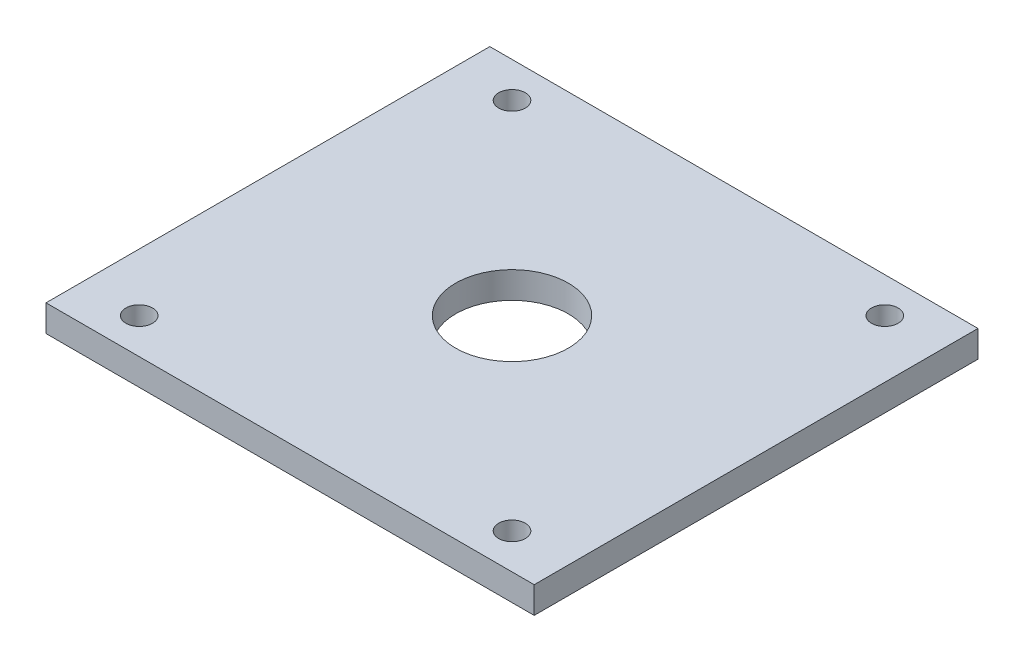
ISO-10303-21;
HEADER;
FILE_DESCRIPTION(('STEP AP214'),'2;1');
FILE_NAME('part.step','',(''),(''),'','','');
FILE_SCHEMA(('AUTOMOTIVE_DESIGN { 1 0 10303 214 1 1 1 1 }'));
ENDSEC;
DATA;
#1=APPLICATION_CONTEXT('core data for automotive mechanical design processes');
#2=APPLICATION_PROTOCOL_DEFINITION('international standard','automotive_design',2000,#1);
#3=PRODUCT_CONTEXT('',#1,'mechanical');
#4=PRODUCT('Part','Part','',(#3));
#5=PRODUCT_RELATED_PRODUCT_CATEGORY('part','',(#4));
#6=PRODUCT_DEFINITION_FORMATION('','',#4);
#7=PRODUCT_DEFINITION_CONTEXT('part definition',#1,'design');
#8=PRODUCT_DEFINITION('design','',#6,#7);
#9=PRODUCT_DEFINITION_SHAPE('','',#8);
#10=(LENGTH_UNIT() NAMED_UNIT(*) SI_UNIT(.MILLI.,.METRE.));
#11=(NAMED_UNIT(*) PLANE_ANGLE_UNIT() SI_UNIT($,.RADIAN.));
#12=(NAMED_UNIT(*) SI_UNIT($,.STERADIAN.) SOLID_ANGLE_UNIT());
#13=UNCERTAINTY_MEASURE_WITH_UNIT(LENGTH_MEASURE(1.E-05),#10,'distance_accuracy_value','');
#14=(GEOMETRIC_REPRESENTATION_CONTEXT(3) GLOBAL_UNCERTAINTY_ASSIGNED_CONTEXT((#13)) GLOBAL_UNIT_ASSIGNED_CONTEXT((#10,
#11,#12)) REPRESENTATION_CONTEXT('',''));
#15=CARTESIAN_POINT('',(0.,0.,0.));
#16=DIRECTION('',(0.,0.,1.));
#17=DIRECTION('',(1.,0.,0.));
#18=AXIS2_PLACEMENT_3D('',#15,#16,#17);
#19=CARTESIAN_POINT('',(27.5,3.,-25.));
#20=DIRECTION('',(-1.,0.,0.));
#21=DIRECTION('',(0.,0.,1.));
#22=AXIS2_PLACEMENT_3D('',#19,#20,#21);
#23=PLANE('',#22);
#24=DIRECTION('',(0.,0.,-1.));
#25=VECTOR('',#24,1.);
#26=CARTESIAN_POINT('',(27.5,0.,-25.));
#27=LINE('',#26,#25);
#28=CARTESIAN_POINT('',(27.5,0.,25.));
#29=VERTEX_POINT('',#28);
#30=CARTESIAN_POINT('',(27.5,0.,-25.));
#31=VERTEX_POINT('',#30);
#32=EDGE_CURVE('E101',#29,#31,#27,.T.);
#33=ORIENTED_EDGE('',*,*,#32,.T.);
#34=DIRECTION('',(0.,-1.,0.));
#35=VECTOR('',#34,1.);
#36=CARTESIAN_POINT('',(27.5,3.,-25.));
#37=LINE('',#36,#35);
#38=CARTESIAN_POINT('',(27.5,3.,-25.));
#39=VERTEX_POINT('',#38);
#40=EDGE_CURVE('E11',#39,#31,#37,.T.);
#41=ORIENTED_EDGE('',*,*,#40,.F.);
#42=DIRECTION('',(0.,0.,-1.));
#43=VECTOR('',#42,1.);
#44=CARTESIAN_POINT('',(27.5,3.,-25.));
#45=LINE('',#44,#43);
#46=CARTESIAN_POINT('',(27.5,3.,25.));
#47=VERTEX_POINT('',#46);
#48=EDGE_CURVE('E89',#47,#39,#45,.T.);
#49=ORIENTED_EDGE('',*,*,#48,.F.);
#50=DIRECTION('',(0.,-1.,0.));
#51=VECTOR('',#50,1.);
#52=CARTESIAN_POINT('',(27.5,3.,25.));
#53=LINE('',#52,#51);
#54=EDGE_CURVE('E97',#47,#29,#53,.T.);
#55=ORIENTED_EDGE('',*,*,#54,.T.);
#56=EDGE_LOOP('',(#33,#41,#49,#55));
#57=FACE_BOUND('',#56,.T.);
#58=ADVANCED_FACE('F38',(#57),#23,.F.);
#59=CARTESIAN_POINT('',(-27.5,3.,-25.));
#60=DIRECTION('',(0.,0.,1.));
#61=DIRECTION('',(1.,0.,0.));
#62=AXIS2_PLACEMENT_3D('',#59,#60,#61);
#63=PLANE('',#62);
#64=DIRECTION('',(-1.,0.,0.));
#65=VECTOR('',#64,1.);
#66=CARTESIAN_POINT('',(-27.5,0.,-25.));
#67=LINE('',#66,#65);
#68=CARTESIAN_POINT('',(-27.5,0.,-25.));
#69=VERTEX_POINT('',#68);
#70=EDGE_CURVE('E93',#31,#69,#67,.T.);
#71=ORIENTED_EDGE('',*,*,#70,.T.);
#72=DIRECTION('',(0.,-1.,0.));
#73=VECTOR('',#72,1.);
#74=CARTESIAN_POINT('',(-27.5,3.,-25.));
#75=LINE('',#74,#73);
#76=CARTESIAN_POINT('',(-27.5,3.,-25.));
#77=VERTEX_POINT('',#76);
#78=EDGE_CURVE('E46',#77,#69,#75,.T.);
#79=ORIENTED_EDGE('',*,*,#78,.F.);
#80=DIRECTION('',(-1.,0.,0.));
#81=VECTOR('',#80,1.);
#82=CARTESIAN_POINT('',(-27.5,3.,-25.));
#83=LINE('',#82,#81);
#84=EDGE_CURVE('E84',#39,#77,#83,.T.);
#85=ORIENTED_EDGE('',*,*,#84,.F.);
#86=ORIENTED_EDGE('',*,*,#40,.T.);
#87=EDGE_LOOP('',(#71,#79,#85,#86));
#88=FACE_BOUND('',#87,.T.);
#89=ADVANCED_FACE('F92',(#88),#63,.F.);
#90=CARTESIAN_POINT('',(-27.5,3.,-25.));
#91=DIRECTION('',(1.,0.,0.));
#92=DIRECTION('',(0.,0.,-1.));
#93=AXIS2_PLACEMENT_3D('',#90,#91,#92);
#94=PLANE('',#93);
#95=DIRECTION('',(0.,0.,1.));
#96=VECTOR('',#95,1.);
#97=CARTESIAN_POINT('',(-27.5,0.,-25.));
#98=LINE('',#97,#96);
#99=CARTESIAN_POINT('',(-27.5,0.,25.));
#100=VERTEX_POINT('',#99);
#101=EDGE_CURVE('E71',#69,#100,#98,.T.);
#102=ORIENTED_EDGE('',*,*,#101,.T.);
#103=DIRECTION('',(0.,-1.,0.));
#104=VECTOR('',#103,1.);
#105=CARTESIAN_POINT('',(-27.5,3.,25.));
#106=LINE('',#105,#104);
#107=CARTESIAN_POINT('',(-27.5,3.,25.));
#108=VERTEX_POINT('',#107);
#109=EDGE_CURVE('E94',#108,#100,#106,.T.);
#110=ORIENTED_EDGE('',*,*,#109,.F.);
#111=DIRECTION('',(0.,0.,1.));
#112=VECTOR('',#111,1.);
#113=CARTESIAN_POINT('',(-27.5,3.,-25.));
#114=LINE('',#113,#112);
#115=EDGE_CURVE('E87',#77,#108,#114,.T.);
#116=ORIENTED_EDGE('',*,*,#115,.F.);
#117=ORIENTED_EDGE('',*,*,#78,.T.);
#118=EDGE_LOOP('',(#102,#110,#116,#117));
#119=FACE_BOUND('',#118,.T.);
#120=ADVANCED_FACE('F95',(#119),#94,.F.);
#121=CARTESIAN_POINT('',(-27.5,3.,25.));
#122=DIRECTION('',(0.,0.,-1.));
#123=DIRECTION('',(-1.,0.,0.));
#124=AXIS2_PLACEMENT_3D('',#121,#122,#123);
#125=PLANE('',#124);
#126=DIRECTION('',(1.,0.,0.));
#127=VECTOR('',#126,1.);
#128=CARTESIAN_POINT('',(-27.5,0.,25.));
#129=LINE('',#128,#127);
#130=EDGE_CURVE('E77',#100,#29,#129,.T.);
#131=ORIENTED_EDGE('',*,*,#130,.T.);
#132=ORIENTED_EDGE('',*,*,#54,.F.);
#133=DIRECTION('',(1.,0.,0.));
#134=VECTOR('',#133,1.);
#135=CARTESIAN_POINT('',(-27.5,3.,25.));
#136=LINE('',#135,#134);
#137=EDGE_CURVE('E54',#108,#47,#136,.T.);
#138=ORIENTED_EDGE('',*,*,#137,.F.);
#139=ORIENTED_EDGE('',*,*,#109,.T.);
#140=EDGE_LOOP('',(#131,#132,#138,#139));
#141=FACE_BOUND('',#140,.T.);
#142=ADVANCED_FACE('F109',(#141),#125,.F.);
#143=CARTESIAN_POINT('',(0.,3.,0.));
#144=DIRECTION('',(0.,1.,0.));
#145=DIRECTION('',(0.,0.,1.));
#146=AXIS2_PLACEMENT_3D('',#143,#144,#145);
#147=PLANE('',#146);
#148=CARTESIAN_POINT('',(-20.9999999999999,3.,21.0000000000001));
#149=DIRECTION('',(0.,1.,0.));
#150=DIRECTION('',(1.,0.,0.));
#151=AXIS2_PLACEMENT_3D('',#148,#149,#150);
#152=CIRCLE('',#151,1.5);
#153=CARTESIAN_POINT('',(-19.4999999999999,3.,21.0000000000001));
#154=VERTEX_POINT('',#153);
#155=EDGE_CURVE('E139',#154,#154,#152,.T.);
#156=ORIENTED_EDGE('',*,*,#155,.F.);
#157=EDGE_LOOP('',(#156));
#158=FACE_BOUND('',#157,.T.);
#159=CARTESIAN_POINT('',(21.,3.,21.));
#160=DIRECTION('',(0.,1.,0.));
#161=DIRECTION('',(0.,0.,-1.));
#162=AXIS2_PLACEMENT_3D('',#159,#160,#161);
#163=CIRCLE('',#162,1.5);
#164=CARTESIAN_POINT('',(21.,3.,19.5));
#165=VERTEX_POINT('',#164);
#166=EDGE_CURVE('E133',#165,#165,#163,.T.);
#167=ORIENTED_EDGE('',*,*,#166,.F.);
#168=EDGE_LOOP('',(#167));
#169=FACE_BOUND('',#168,.T.);
#170=CARTESIAN_POINT('',(20.9999999999998,3.,-21.0000000000002));
#171=DIRECTION('',(0.,1.,0.));
#172=DIRECTION('',(-1.,0.,0.));
#173=AXIS2_PLACEMENT_3D('',#170,#171,#172);
#174=CIRCLE('',#173,1.5);
#175=CARTESIAN_POINT('',(19.4999999999998,3.,-21.0000000000002));
#176=VERTEX_POINT('',#175);
#177=EDGE_CURVE('E127',#176,#176,#174,.T.);
#178=ORIENTED_EDGE('',*,*,#177,.F.);
#179=EDGE_LOOP('',(#178));
#180=FACE_BOUND('',#179,.T.);
#181=CARTESIAN_POINT('',(-21.,3.,-21.));
#182=DIRECTION('',(0.,1.,0.));
#183=DIRECTION('',(0.,0.,1.));
#184=AXIS2_PLACEMENT_3D('',#181,#182,#183);
#185=CIRCLE('',#184,1.5);
#186=CARTESIAN_POINT('',(-21.,3.,-19.5));
#187=VERTEX_POINT('',#186);
#188=EDGE_CURVE('E121',#187,#187,#185,.T.);
#189=ORIENTED_EDGE('',*,*,#188,.F.);
#190=EDGE_LOOP('',(#189));
#191=FACE_BOUND('',#190,.T.);
#192=CARTESIAN_POINT('',(0.,3.,0.));
#193=DIRECTION('',(0.,1.,0.));
#194=DIRECTION('',(0.,0.,1.));
#195=AXIS2_PLACEMENT_3D('',#192,#193,#194);
#196=CIRCLE('',#195,6.35);
#197=CARTESIAN_POINT('',(0.,3.,6.35));
#198=VERTEX_POINT('',#197);
#199=EDGE_CURVE('E115',#198,#198,#196,.T.);
#200=ORIENTED_EDGE('',*,*,#199,.F.);
#201=EDGE_LOOP('',(#200));
#202=FACE_BOUND('',#201,.T.);
#203=ORIENTED_EDGE('',*,*,#48,.T.);
#204=ORIENTED_EDGE('',*,*,#84,.T.);
#205=ORIENTED_EDGE('',*,*,#115,.T.);
#206=ORIENTED_EDGE('',*,*,#137,.T.);
#207=EDGE_LOOP('',(#203,#204,#205,#206));
#208=FACE_BOUND('',#207,.T.);
#209=ADVANCED_FACE('F85',(#158,#169,#180,#191,#202,#208),#147,.T.);
#210=CARTESIAN_POINT('',(0.,0.,0.));
#211=DIRECTION('',(0.,1.,0.));
#212=DIRECTION('',(0.,0.,1.));
#213=AXIS2_PLACEMENT_3D('',#210,#211,#212);
#214=PLANE('',#213);
#215=CARTESIAN_POINT('',(-20.9999999999999,0.,21.0000000000001));
#216=DIRECTION('',(0.,1.,0.));
#217=DIRECTION('',(1.,0.,0.));
#218=AXIS2_PLACEMENT_3D('',#215,#216,#217);
#219=CIRCLE('',#218,1.5);
#220=CARTESIAN_POINT('',(-19.4999999999999,0.,21.0000000000001));
#221=VERTEX_POINT('',#220);
#222=EDGE_CURVE('E124',#221,#221,#219,.T.);
#223=ORIENTED_EDGE('',*,*,#222,.T.);
#224=EDGE_LOOP('',(#223));
#225=FACE_BOUND('',#224,.T.);
#226=CARTESIAN_POINT('',(21.,0.,21.));
#227=DIRECTION('',(0.,1.,0.));
#228=DIRECTION('',(0.,0.,-1.));
#229=AXIS2_PLACEMENT_3D('',#226,#227,#228);
#230=CIRCLE('',#229,1.5);
#231=CARTESIAN_POINT('',(21.,0.,19.5));
#232=VERTEX_POINT('',#231);
#233=EDGE_CURVE('E136',#232,#232,#230,.T.);
#234=ORIENTED_EDGE('',*,*,#233,.T.);
#235=EDGE_LOOP('',(#234));
#236=FACE_BOUND('',#235,.T.);
#237=CARTESIAN_POINT('',(20.9999999999998,0.,-21.0000000000002));
#238=DIRECTION('',(0.,1.,0.));
#239=DIRECTION('',(-1.,0.,0.));
#240=AXIS2_PLACEMENT_3D('',#237,#238,#239);
#241=CIRCLE('',#240,1.5);
#242=CARTESIAN_POINT('',(19.4999999999998,0.,-21.0000000000002));
#243=VERTEX_POINT('',#242);
#244=EDGE_CURVE('E130',#243,#243,#241,.T.);
#245=ORIENTED_EDGE('',*,*,#244,.T.);
#246=EDGE_LOOP('',(#245));
#247=FACE_BOUND('',#246,.T.);
#248=CARTESIAN_POINT('',(-21.,0.,-21.));
#249=DIRECTION('',(0.,1.,0.));
#250=DIRECTION('',(0.,0.,1.));
#251=AXIS2_PLACEMENT_3D('',#248,#249,#250);
#252=CIRCLE('',#251,1.5);
#253=CARTESIAN_POINT('',(-21.,0.,-19.5));
#254=VERTEX_POINT('',#253);
#255=EDGE_CURVE('E118',#254,#254,#252,.T.);
#256=ORIENTED_EDGE('',*,*,#255,.T.);
#257=EDGE_LOOP('',(#256));
#258=FACE_BOUND('',#257,.T.);
#259=CARTESIAN_POINT('',(0.,0.,0.));
#260=DIRECTION('',(0.,1.,0.));
#261=DIRECTION('',(0.,0.,1.));
#262=AXIS2_PLACEMENT_3D('',#259,#260,#261);
#263=CIRCLE('',#262,6.35);
#264=CARTESIAN_POINT('',(0.,0.,6.35));
#265=VERTEX_POINT('',#264);
#266=EDGE_CURVE('E104',#265,#265,#263,.T.);
#267=ORIENTED_EDGE('',*,*,#266,.T.);
#268=EDGE_LOOP('',(#267));
#269=FACE_BOUND('',#268,.T.);
#270=ORIENTED_EDGE('',*,*,#32,.F.);
#271=ORIENTED_EDGE('',*,*,#130,.F.);
#272=ORIENTED_EDGE('',*,*,#101,.F.);
#273=ORIENTED_EDGE('',*,*,#70,.F.);
#274=EDGE_LOOP('',(#270,#271,#272,#273));
#275=FACE_BOUND('',#274,.T.);
#276=ADVANCED_FACE('F112',(#225,#236,#247,#258,#269,#275),#214,.F.);
#277=CARTESIAN_POINT('',(0.,0.,0.));
#278=DIRECTION('',(0.,1.,0.));
#279=DIRECTION('',(0.,0.,1.));
#280=AXIS2_PLACEMENT_3D('',#277,#278,#279);
#281=CYLINDRICAL_SURFACE('',#280,6.35);
#282=ORIENTED_EDGE('',*,*,#266,.F.);
#283=EDGE_LOOP('',(#282));
#284=FACE_BOUND('',#283,.T.);
#285=ORIENTED_EDGE('',*,*,#199,.T.);
#286=EDGE_LOOP('',(#285));
#287=FACE_BOUND('',#286,.T.);
#288=ADVANCED_FACE('F165',(#284,#287),#281,.F.);
#289=CARTESIAN_POINT('',(-21.,0.,-21.));
#290=DIRECTION('',(0.,1.,0.));
#291=DIRECTION('',(0.,0.,1.));
#292=AXIS2_PLACEMENT_3D('',#289,#290,#291);
#293=CYLINDRICAL_SURFACE('',#292,1.5);
#294=ORIENTED_EDGE('',*,*,#255,.F.);
#295=EDGE_LOOP('',(#294));
#296=FACE_BOUND('',#295,.T.);
#297=ORIENTED_EDGE('',*,*,#188,.T.);
#298=EDGE_LOOP('',(#297));
#299=FACE_BOUND('',#298,.T.);
#300=ADVANCED_FACE('F167',(#296,#299),#293,.F.);
#301=CARTESIAN_POINT('',(20.9999999999998,0.,-21.0000000000002));
#302=DIRECTION('',(0.,1.,0.));
#303=DIRECTION('',(0.,0.,1.));
#304=AXIS2_PLACEMENT_3D('',#301,#302,#303);
#305=CYLINDRICAL_SURFACE('',#304,1.5);
#306=ORIENTED_EDGE('',*,*,#244,.F.);
#307=EDGE_LOOP('',(#306));
#308=FACE_BOUND('',#307,.T.);
#309=ORIENTED_EDGE('',*,*,#177,.T.);
#310=EDGE_LOOP('',(#309));
#311=FACE_BOUND('',#310,.T.);
#312=ADVANCED_FACE('F174',(#308,#311),#305,.F.);
#313=CARTESIAN_POINT('',(21.,0.,21.));
#314=DIRECTION('',(0.,1.,0.));
#315=DIRECTION('',(0.,0.,1.));
#316=AXIS2_PLACEMENT_3D('',#313,#314,#315);
#317=CYLINDRICAL_SURFACE('',#316,1.5);
#318=ORIENTED_EDGE('',*,*,#233,.F.);
#319=EDGE_LOOP('',(#318));
#320=FACE_BOUND('',#319,.T.);
#321=ORIENTED_EDGE('',*,*,#166,.T.);
#322=EDGE_LOOP('',(#321));
#323=FACE_BOUND('',#322,.T.);
#324=ADVANCED_FACE('F150',(#320,#323),#317,.F.);
#325=CARTESIAN_POINT('',(-20.9999999999999,0.,21.0000000000001));
#326=DIRECTION('',(0.,1.,0.));
#327=DIRECTION('',(0.,0.,1.));
#328=AXIS2_PLACEMENT_3D('',#325,#326,#327);
#329=CYLINDRICAL_SURFACE('',#328,1.5);
#330=ORIENTED_EDGE('',*,*,#222,.F.);
#331=EDGE_LOOP('',(#330));
#332=FACE_BOUND('',#331,.T.);
#333=ORIENTED_EDGE('',*,*,#155,.T.);
#334=EDGE_LOOP('',(#333));
#335=FACE_BOUND('',#334,.T.);
#336=ADVANCED_FACE('F147',(#332,#335),#329,.F.);
#337=CLOSED_SHELL('',(#58,#89,#120,#142,#209,#276,#288,#300,#312,#324,#336));
#338=MANIFOLD_SOLID_BREP('B2',#337);
#339=ADVANCED_BREP_SHAPE_REPRESENTATION('',(#18,#338),#14);
#340=SHAPE_DEFINITION_REPRESENTATION(#9,#339);
ENDSEC;
END-ISO-10303-21;
